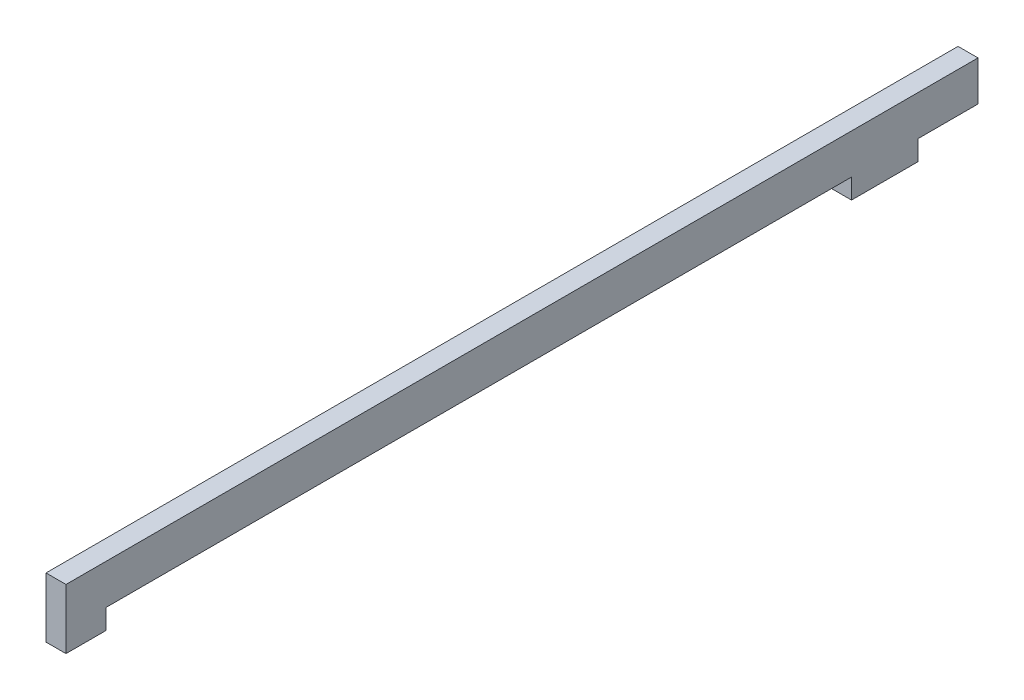
ISO-10303-21;
HEADER;
FILE_DESCRIPTION(('STEP AP214'),'2;1');
FILE_NAME('part.step','',(''),(''),'','','');
FILE_SCHEMA(('AUTOMOTIVE_DESIGN { 1 0 10303 214 1 1 1 1 }'));
ENDSEC;
DATA;
#1=APPLICATION_CONTEXT('core data for automotive mechanical design processes');
#2=APPLICATION_PROTOCOL_DEFINITION('international standard','automotive_design',2000,#1);
#3=PRODUCT_CONTEXT('',#1,'mechanical');
#4=PRODUCT('Part','Part','',(#3));
#5=PRODUCT_RELATED_PRODUCT_CATEGORY('part','',(#4));
#6=PRODUCT_DEFINITION_FORMATION('','',#4);
#7=PRODUCT_DEFINITION_CONTEXT('part definition',#1,'design');
#8=PRODUCT_DEFINITION('design','',#6,#7);
#9=PRODUCT_DEFINITION_SHAPE('','',#8);
#10=(LENGTH_UNIT() NAMED_UNIT(*) SI_UNIT(.MILLI.,.METRE.));
#11=(NAMED_UNIT(*) PLANE_ANGLE_UNIT() SI_UNIT($,.RADIAN.));
#12=(NAMED_UNIT(*) SI_UNIT($,.STERADIAN.) SOLID_ANGLE_UNIT());
#13=UNCERTAINTY_MEASURE_WITH_UNIT(LENGTH_MEASURE(1.E-05),#10,'distance_accuracy_value','');
#14=(GEOMETRIC_REPRESENTATION_CONTEXT(3) GLOBAL_UNCERTAINTY_ASSIGNED_CONTEXT((#13)) GLOBAL_UNIT_ASSIGNED_CONTEXT((#10,
#11,#12)) REPRESENTATION_CONTEXT('',''));
#15=CARTESIAN_POINT('',(0.,0.,0.));
#16=DIRECTION('',(0.,0.,1.));
#17=DIRECTION('',(1.,0.,0.));
#18=AXIS2_PLACEMENT_3D('',#15,#16,#17);
#19=CARTESIAN_POINT('',(-176.272727272727,63.8,-287.416407864999));
#20=DIRECTION('',(0.,-1.,0.));
#21=DIRECTION('',(0.,0.,-1.));
#22=AXIS2_PLACEMENT_3D('',#19,#20,#21);
#23=PLANE('',#22);
#24=CARTESIAN_POINT('',(-170.272727272727,63.8,-236.));
#25=CARTESIAN_POINT('',(-176.272727272727,63.8,-236.));
#26=B_SPLINE_CURVE_WITH_KNOTS('',1,(#24,#25),.UNSPECIFIED.,.F.,.F.,(2,2),(0.,0.115384615384616),.UNSPECIFIED.);
#27=CARTESIAN_POINT('',(-170.272727272727,63.8,-236.));
#28=VERTEX_POINT('',#27);
#29=CARTESIAN_POINT('',(-176.272727272727,63.8,-236.));
#30=VERTEX_POINT('',#29);
#31=EDGE_CURVE('E204',#28,#30,#26,.T.);
#32=ORIENTED_EDGE('',*,*,#31,.F.);
#33=DIRECTION('',(0.,0.,1.));
#34=VECTOR('',#33,1.);
#35=CARTESIAN_POINT('',(-170.272727272727,63.8,-287.416407864999));
#36=LINE('',#35,#34);
#37=CARTESIAN_POINT('',(-170.272727272727,63.8,-12.));
#38=VERTEX_POINT('',#37);
#39=EDGE_CURVE('E299',#28,#38,#36,.T.);
#40=ORIENTED_EDGE('',*,*,#39,.T.);
#41=DIRECTION('',(1.,0.,0.));
#42=VECTOR('',#41,1.);
#43=CARTESIAN_POINT('',(-176.272727272727,63.8,-12.));
#44=LINE('',#43,#42);
#45=CARTESIAN_POINT('',(-176.272727272727,63.8,-12.));
#46=VERTEX_POINT('',#45);
#47=EDGE_CURVE('E293',#46,#38,#44,.T.);
#48=ORIENTED_EDGE('',*,*,#47,.F.);
#49=DIRECTION('',(0.,0.,1.));
#50=VECTOR('',#49,1.);
#51=CARTESIAN_POINT('',(-176.272727272727,63.8,-287.416407864999));
#52=LINE('',#51,#50);
#53=EDGE_CURVE('E104',#30,#46,#52,.T.);
#54=ORIENTED_EDGE('',*,*,#53,.F.);
#55=EDGE_LOOP('',(#32,#40,#48,#54));
#56=FACE_BOUND('',#55,.T.);
#57=ADVANCED_FACE('F96',(#56),#23,.T.);
#58=CARTESIAN_POINT('',(0.,0.,-274.));
#59=DIRECTION('',(0.,0.,-1.));
#60=DIRECTION('',(-1.,0.,0.));
#61=AXIS2_PLACEMENT_3D('',#58,#59,#60);
#62=PLANE('',#61);
#63=DIRECTION('',(0.,-1.,0.));
#64=VECTOR('',#63,1.);
#65=CARTESIAN_POINT('',(-176.272727272727,75.8,-274.));
#66=LINE('',#65,#64);
#67=CARTESIAN_POINT('',(-176.272727272727,75.8,-274.));
#68=VERTEX_POINT('',#67);
#69=CARTESIAN_POINT('',(-176.272727272727,63.8,-274.));
#70=VERTEX_POINT('',#69);
#71=EDGE_CURVE('E300',#68,#70,#66,.T.);
#72=ORIENTED_EDGE('',*,*,#71,.F.);
#73=DIRECTION('',(-1.,0.,0.));
#74=VECTOR('',#73,1.);
#75=CARTESIAN_POINT('',(-176.272727272727,75.8,-274.));
#76=LINE('',#75,#74);
#77=CARTESIAN_POINT('',(-170.272727272727,75.8,-274.));
#78=VERTEX_POINT('',#77);
#79=EDGE_CURVE('E189',#78,#68,#76,.T.);
#80=ORIENTED_EDGE('',*,*,#79,.F.);
#81=DIRECTION('',(0.,1.,0.));
#82=VECTOR('',#81,1.);
#83=CARTESIAN_POINT('',(-170.272727272727,75.8,-274.));
#84=LINE('',#83,#82);
#85=CARTESIAN_POINT('',(-170.272727272727,63.8,-274.));
#86=VERTEX_POINT('',#85);
#87=EDGE_CURVE('E186',#86,#78,#84,.T.);
#88=ORIENTED_EDGE('',*,*,#87,.F.);
#89=DIRECTION('',(1.,0.,0.));
#90=VECTOR('',#89,1.);
#91=CARTESIAN_POINT('',(-176.272727272727,63.8,-274.));
#92=LINE('',#91,#90);
#93=EDGE_CURVE('E296',#70,#86,#92,.T.);
#94=ORIENTED_EDGE('',*,*,#93,.F.);
#95=EDGE_LOOP('',(#72,#80,#88,#94));
#96=FACE_BOUND('',#95,.T.);
#97=ADVANCED_FACE('F98',(#96),#62,.T.);
#98=CARTESIAN_POINT('',(-176.272727272727,75.8,-287.416407864999));
#99=DIRECTION('',(-1.,0.,0.));
#100=DIRECTION('',(0.,0.,1.));
#101=AXIS2_PLACEMENT_3D('',#98,#99,#100);
#102=PLANE('',#101);
#103=CARTESIAN_POINT('',(-176.272727272727,63.8,-256.));
#104=VERTEX_POINT('',#103);
#105=EDGE_CURVE('E13',#70,#104,#52,.T.);
#106=ORIENTED_EDGE('',*,*,#105,.T.);
#107=DIRECTION('',(0.,1.,0.));
#108=VECTOR('',#107,1.);
#109=CARTESIAN_POINT('',(-176.272727272727,57.8,-256.));
#110=LINE('',#109,#108);
#111=CARTESIAN_POINT('',(-176.272727272727,57.8,-256.));
#112=VERTEX_POINT('',#111);
#113=EDGE_CURVE('E256',#112,#104,#110,.T.);
#114=ORIENTED_EDGE('',*,*,#113,.F.);
#115=CARTESIAN_POINT('',(-176.272727272727,57.8,-236.));
#116=CARTESIAN_POINT('',(-176.272727272727,57.8,-256.));
#117=B_SPLINE_CURVE_WITH_KNOTS('',1,(#115,#116),.UNSPECIFIED.,.F.,.F.,(2,2),(0.115384615384616,
0.5),.UNSPECIFIED.);
#118=CARTESIAN_POINT('',(-176.272727272727,57.8,-236.));
#119=VERTEX_POINT('',#118);
#120=EDGE_CURVE('E215',#119,#112,#117,.T.);
#121=ORIENTED_EDGE('',*,*,#120,.F.);
#122=DIRECTION('',(0.,1.,0.));
#123=VECTOR('',#122,1.);
#124=CARTESIAN_POINT('',(-176.272727272727,57.8,-236.));
#125=LINE('',#124,#123);
#126=EDGE_CURVE('E259',#119,#30,#125,.T.);
#127=ORIENTED_EDGE('',*,*,#126,.T.);
#128=ORIENTED_EDGE('',*,*,#53,.T.);
#129=DIRECTION('',(0.,-1.,0.));
#130=VECTOR('',#129,1.);
#131=CARTESIAN_POINT('',(-176.272727272727,63.9,-12.));
#132=LINE('',#131,#130);
#133=CARTESIAN_POINT('',(-176.272727272727,57.8,-12.));
#134=VERTEX_POINT('',#133);
#135=EDGE_CURVE('E279',#46,#134,#132,.T.);
#136=ORIENTED_EDGE('',*,*,#135,.T.);
#137=DIRECTION('',(0.,0.,1.));
#138=VECTOR('',#137,1.);
#139=CARTESIAN_POINT('',(-176.272727272727,57.8,-12.));
#140=LINE('',#139,#138);
#141=CARTESIAN_POINT('',(-176.272727272727,57.8,0.));
#142=VERTEX_POINT('',#141);
#143=EDGE_CURVE('E286',#134,#142,#140,.T.);
#144=ORIENTED_EDGE('',*,*,#143,.T.);
#145=CARTESIAN_POINT('',(-176.272727272727,57.8,0.));
#146=CARTESIAN_POINT('',(-176.272727272727,63.6,0.));
#147=B_SPLINE_CURVE_WITH_KNOTS('',1,(#145,#146),.UNSPECIFIED.,.F.,.F.,(2,2),(0.254237288135593,
0.5),.UNSPECIFIED.);
#148=CARTESIAN_POINT('',(-176.272727272727,63.6,0.));
#149=VERTEX_POINT('',#148);
#150=EDGE_CURVE('E266',#142,#149,#147,.T.);
#151=ORIENTED_EDGE('',*,*,#150,.T.);
#152=DIRECTION('',(0.,-1.,0.));
#153=VECTOR('',#152,1.);
#154=CARTESIAN_POINT('',(-176.272727272727,75.8,0.));
#155=LINE('',#154,#153);
#156=CARTESIAN_POINT('',(-176.272727272727,75.8,0.));
#157=VERTEX_POINT('',#156);
#158=EDGE_CURVE('E199',#157,#149,#155,.T.);
#159=ORIENTED_EDGE('',*,*,#158,.F.);
#160=DIRECTION('',(0.,0.,1.));
#161=VECTOR('',#160,1.);
#162=CARTESIAN_POINT('',(-176.272727272727,75.8,-287.416407864999));
#163=LINE('',#162,#161);
#164=EDGE_CURVE('E195',#68,#157,#163,.T.);
#165=ORIENTED_EDGE('',*,*,#164,.F.);
#166=ORIENTED_EDGE('',*,*,#71,.T.);
#167=EDGE_LOOP('',(#106,#114,#121,#127,#128,#136,#144,#151,#159,#165,#166));
#168=FACE_BOUND('',#167,.T.);
#169=ADVANCED_FACE('F319',(#168),#102,.T.);
#170=CARTESIAN_POINT('',(-176.272727272727,75.8,-287.416407864999));
#171=DIRECTION('',(0.,1.,0.));
#172=DIRECTION('',(0.,0.,1.));
#173=AXIS2_PLACEMENT_3D('',#170,#171,#172);
#174=PLANE('',#173);
#175=ORIENTED_EDGE('',*,*,#164,.T.);
#176=DIRECTION('',(-1.,0.,0.));
#177=VECTOR('',#176,1.);
#178=CARTESIAN_POINT('',(-176.272727272727,75.8,0.));
#179=LINE('',#178,#177);
#180=CARTESIAN_POINT('',(-170.272727272727,75.8,0.));
#181=VERTEX_POINT('',#180);
#182=EDGE_CURVE('E192',#181,#157,#179,.T.);
#183=ORIENTED_EDGE('',*,*,#182,.F.);
#184=DIRECTION('',(0.,0.,1.));
#185=VECTOR('',#184,1.);
#186=CARTESIAN_POINT('',(-170.272727272727,75.8,-287.416407864999));
#187=LINE('',#186,#185);
#188=EDGE_CURVE('E179',#78,#181,#187,.T.);
#189=ORIENTED_EDGE('',*,*,#188,.F.);
#190=ORIENTED_EDGE('',*,*,#79,.T.);
#191=EDGE_LOOP('',(#175,#183,#189,#190));
#192=FACE_BOUND('',#191,.T.);
#193=ADVANCED_FACE('F193',(#192),#174,.T.);
#194=CARTESIAN_POINT('',(-170.272727272727,75.8,-287.416407864999));
#195=DIRECTION('',(1.,0.,0.));
#196=DIRECTION('',(0.,0.,-1.));
#197=AXIS2_PLACEMENT_3D('',#194,#195,#196);
#198=PLANE('',#197);
#199=ORIENTED_EDGE('',*,*,#188,.T.);
#200=DIRECTION('',(0.,1.,0.));
#201=VECTOR('',#200,1.);
#202=CARTESIAN_POINT('',(-170.272727272727,75.8,0.));
#203=LINE('',#202,#201);
#204=CARTESIAN_POINT('',(-170.272727272727,63.6,0.));
#205=VERTEX_POINT('',#204);
#206=EDGE_CURVE('E184',#205,#181,#203,.T.);
#207=ORIENTED_EDGE('',*,*,#206,.F.);
#208=CARTESIAN_POINT('',(-170.272727272727,63.6,0.));
#209=CARTESIAN_POINT('',(-170.272727272727,57.8,0.));
#210=B_SPLINE_CURVE_WITH_KNOTS('',1,(#208,#209),.UNSPECIFIED.,.F.,.F.,(2,2),(0.754237288135593,
1.),.UNSPECIFIED.);
#211=CARTESIAN_POINT('',(-170.272727272727,57.8,0.));
#212=VERTEX_POINT('',#211);
#213=EDGE_CURVE('E203',#205,#212,#210,.T.);
#214=ORIENTED_EDGE('',*,*,#213,.T.);
#215=DIRECTION('',(0.,0.,1.));
#216=VECTOR('',#215,1.);
#217=CARTESIAN_POINT('',(-170.272727272727,57.8,-12.));
#218=LINE('',#217,#216);
#219=CARTESIAN_POINT('',(-170.272727272727,57.8,-12.));
#220=VERTEX_POINT('',#219);
#221=EDGE_CURVE('E285',#220,#212,#218,.T.);
#222=ORIENTED_EDGE('',*,*,#221,.F.);
#223=DIRECTION('',(0.,-1.,0.));
#224=VECTOR('',#223,1.);
#225=CARTESIAN_POINT('',(-170.272727272727,63.9,-12.));
#226=LINE('',#225,#224);
#227=EDGE_CURVE('E280',#38,#220,#226,.T.);
#228=ORIENTED_EDGE('',*,*,#227,.F.);
#229=ORIENTED_EDGE('',*,*,#39,.F.);
#230=DIRECTION('',(0.,1.,0.));
#231=VECTOR('',#230,1.);
#232=CARTESIAN_POINT('',(-170.272727272727,57.8,-236.));
#233=LINE('',#232,#231);
#234=CARTESIAN_POINT('',(-170.272727272727,57.8,-236.));
#235=VERTEX_POINT('',#234);
#236=EDGE_CURVE('E235',#235,#28,#233,.T.);
#237=ORIENTED_EDGE('',*,*,#236,.F.);
#238=CARTESIAN_POINT('',(-170.272727272727,57.8,-256.));
#239=CARTESIAN_POINT('',(-170.272727272727,57.8,-236.));
#240=B_SPLINE_CURVE_WITH_KNOTS('',1,(#238,#239),.UNSPECIFIED.,.F.,.F.,(2,2),(0.615384615384616,
1.),.UNSPECIFIED.);
#241=CARTESIAN_POINT('',(-170.272727272727,57.8,-256.));
#242=VERTEX_POINT('',#241);
#243=EDGE_CURVE('E229',#242,#235,#240,.T.);
#244=ORIENTED_EDGE('',*,*,#243,.F.);
#245=DIRECTION('',(0.,1.,0.));
#246=VECTOR('',#245,1.);
#247=CARTESIAN_POINT('',(-170.272727272727,57.8,-256.));
#248=LINE('',#247,#246);
#249=CARTESIAN_POINT('',(-170.272727272727,63.8,-256.));
#250=VERTEX_POINT('',#249);
#251=EDGE_CURVE('E253',#242,#250,#248,.T.);
#252=ORIENTED_EDGE('',*,*,#251,.T.);
#253=EDGE_CURVE('E305',#86,#250,#36,.T.);
#254=ORIENTED_EDGE('',*,*,#253,.F.);
#255=ORIENTED_EDGE('',*,*,#87,.T.);
#256=EDGE_LOOP('',(#199,#207,#214,#222,#228,#229,#237,#244,#252,#254,#255));
#257=FACE_BOUND('',#256,.T.);
#258=ADVANCED_FACE('F181',(#257),#198,.T.);
#259=CARTESIAN_POINT('',(-176.272727272727,63.8,-256.));
#260=CARTESIAN_POINT('',(-170.272727272727,63.8,-256.));
#261=B_SPLINE_CURVE_WITH_KNOTS('',1,(#259,#260),.UNSPECIFIED.,.F.,.F.,(2,2),(0.5,
0.615384615384616),.UNSPECIFIED.);
#262=EDGE_CURVE('E118',#104,#250,#261,.T.);
#263=ORIENTED_EDGE('',*,*,#262,.F.);
#264=ORIENTED_EDGE('',*,*,#105,.F.);
#265=ORIENTED_EDGE('',*,*,#93,.T.);
#266=ORIENTED_EDGE('',*,*,#253,.T.);
#267=EDGE_LOOP('',(#263,#264,#265,#266));
#268=FACE_BOUND('',#267,.T.);
#269=ADVANCED_FACE('F332',(#268),#23,.T.);
#270=CARTESIAN_POINT('',(-170.272727272727,63.9,-12.));
#271=DIRECTION('',(0.,0.,-1.));
#272=DIRECTION('',(-1.,0.,0.));
#273=AXIS2_PLACEMENT_3D('',#270,#271,#272);
#274=PLANE('',#273);
#275=ORIENTED_EDGE('',*,*,#135,.F.);
#276=ORIENTED_EDGE('',*,*,#47,.T.);
#277=ORIENTED_EDGE('',*,*,#227,.T.);
#278=DIRECTION('',(-1.,0.,0.));
#279=VECTOR('',#278,1.);
#280=CARTESIAN_POINT('',(-170.272727272727,57.8,-12.));
#281=LINE('',#280,#279);
#282=EDGE_CURVE('E288',#220,#134,#281,.T.);
#283=ORIENTED_EDGE('',*,*,#282,.T.);
#284=EDGE_LOOP('',(#275,#276,#277,#283));
#285=FACE_BOUND('',#284,.T.);
#286=ADVANCED_FACE('F311',(#285),#274,.T.);
#287=CARTESIAN_POINT('',(-170.272727272727,57.8,-12.));
#288=DIRECTION('',(0.,-1.,0.));
#289=DIRECTION('',(0.,0.,-1.));
#290=AXIS2_PLACEMENT_3D('',#287,#288,#289);
#291=PLANE('',#290);
#292=ORIENTED_EDGE('',*,*,#143,.F.);
#293=ORIENTED_EDGE('',*,*,#282,.F.);
#294=ORIENTED_EDGE('',*,*,#221,.T.);
#295=CARTESIAN_POINT('',(-170.272727272727,57.8,0.));
#296=CARTESIAN_POINT('',(-176.272727272727,57.8,0.));
#297=B_SPLINE_CURVE_WITH_KNOTS('',1,(#295,#296),.UNSPECIFIED.,.F.,.F.,(2,2),(0.,
0.254237288135593),.UNSPECIFIED.);
#298=EDGE_CURVE('E261',#212,#142,#297,.T.);
#299=ORIENTED_EDGE('',*,*,#298,.T.);
#300=EDGE_LOOP('',(#292,#293,#294,#299));
#301=FACE_BOUND('',#300,.T.);
#302=ADVANCED_FACE('F316',(#301),#291,.T.);
#303=CARTESIAN_POINT('',(-173.272727272727,57.8,0.));
#304=DIRECTION('',(0.,0.,1.));
#305=DIRECTION('',(1.,0.,0.));
#306=AXIS2_PLACEMENT_3D('',#303,#304,#305);
#307=PLANE('',#306);
#308=ORIENTED_EDGE('',*,*,#298,.F.);
#309=ORIENTED_EDGE('',*,*,#213,.F.);
#310=ORIENTED_EDGE('',*,*,#206,.T.);
#311=ORIENTED_EDGE('',*,*,#182,.T.);
#312=ORIENTED_EDGE('',*,*,#158,.T.);
#313=ORIENTED_EDGE('',*,*,#150,.F.);
#314=EDGE_LOOP('',(#308,#309,#310,#311,#312,#313));
#315=FACE_BOUND('',#314,.T.);
#316=ADVANCED_FACE('F202',(#315),#307,.T.);
#317=CARTESIAN_POINT('',(-170.272727272727,57.8,-236.));
#318=DIRECTION('',(0.,0.,-1.));
#319=DIRECTION('',(-1.,0.,0.));
#320=AXIS2_PLACEMENT_3D('',#317,#318,#319);
#321=PLANE('',#320);
#322=ORIENTED_EDGE('',*,*,#31,.T.);
#323=ORIENTED_EDGE('',*,*,#126,.F.);
#324=CARTESIAN_POINT('',(-170.272727272727,57.8,-236.));
#325=CARTESIAN_POINT('',(-176.272727272727,57.8,-236.));
#326=B_SPLINE_CURVE_WITH_KNOTS('',1,(#324,#325),.UNSPECIFIED.,.F.,.F.,(2,2),(0.,
0.115384615384616),.UNSPECIFIED.);
#327=EDGE_CURVE('E210',#235,#119,#326,.T.);
#328=ORIENTED_EDGE('',*,*,#327,.F.);
#329=ORIENTED_EDGE('',*,*,#236,.T.);
#330=EDGE_LOOP('',(#322,#323,#328,#329));
#331=FACE_BOUND('',#330,.T.);
#332=ADVANCED_FACE('F324',(#331),#321,.F.);
#333=CARTESIAN_POINT('',(-176.272727272727,57.8,-256.));
#334=DIRECTION('',(0.,0.,1.));
#335=DIRECTION('',(1.,0.,0.));
#336=AXIS2_PLACEMENT_3D('',#333,#334,#335);
#337=PLANE('',#336);
#338=ORIENTED_EDGE('',*,*,#262,.T.);
#339=ORIENTED_EDGE('',*,*,#251,.F.);
#340=CARTESIAN_POINT('',(-176.272727272727,57.8,-256.));
#341=CARTESIAN_POINT('',(-170.272727272727,57.8,-256.));
#342=B_SPLINE_CURVE_WITH_KNOTS('',1,(#340,#341),.UNSPECIFIED.,.F.,.F.,(2,2),(0.5,
0.615384615384616),.UNSPECIFIED.);
#343=EDGE_CURVE('E222',#112,#242,#342,.T.);
#344=ORIENTED_EDGE('',*,*,#343,.F.);
#345=ORIENTED_EDGE('',*,*,#113,.T.);
#346=EDGE_LOOP('',(#338,#339,#344,#345));
#347=FACE_BOUND('',#346,.T.);
#348=ADVANCED_FACE('F331',(#347),#337,.F.);
#349=CARTESIAN_POINT('',(-173.272727272727,57.8,-236.));
#350=DIRECTION('',(0.,1.,0.));
#351=DIRECTION('',(0.,0.,1.));
#352=AXIS2_PLACEMENT_3D('',#349,#350,#351);
#353=PLANE('',#352);
#354=ORIENTED_EDGE('',*,*,#327,.T.);
#355=ORIENTED_EDGE('',*,*,#120,.T.);
#356=ORIENTED_EDGE('',*,*,#343,.T.);
#357=ORIENTED_EDGE('',*,*,#243,.T.);
#358=EDGE_LOOP('',(#354,#355,#356,#357));
#359=FACE_BOUND('',#358,.T.);
#360=ADVANCED_FACE('F328',(#359),#353,.F.);
#361=CLOSED_SHELL('',(#57,#97,#169,#193,#258,#269,#286,#302,#316,#332,#348,#360));
#362=MANIFOLD_SOLID_BREP('B2',#361);
#363=ADVANCED_BREP_SHAPE_REPRESENTATION('',(#18,#362),#14);
#364=SHAPE_DEFINITION_REPRESENTATION(#9,#363);
ENDSEC;
END-ISO-10303-21;
